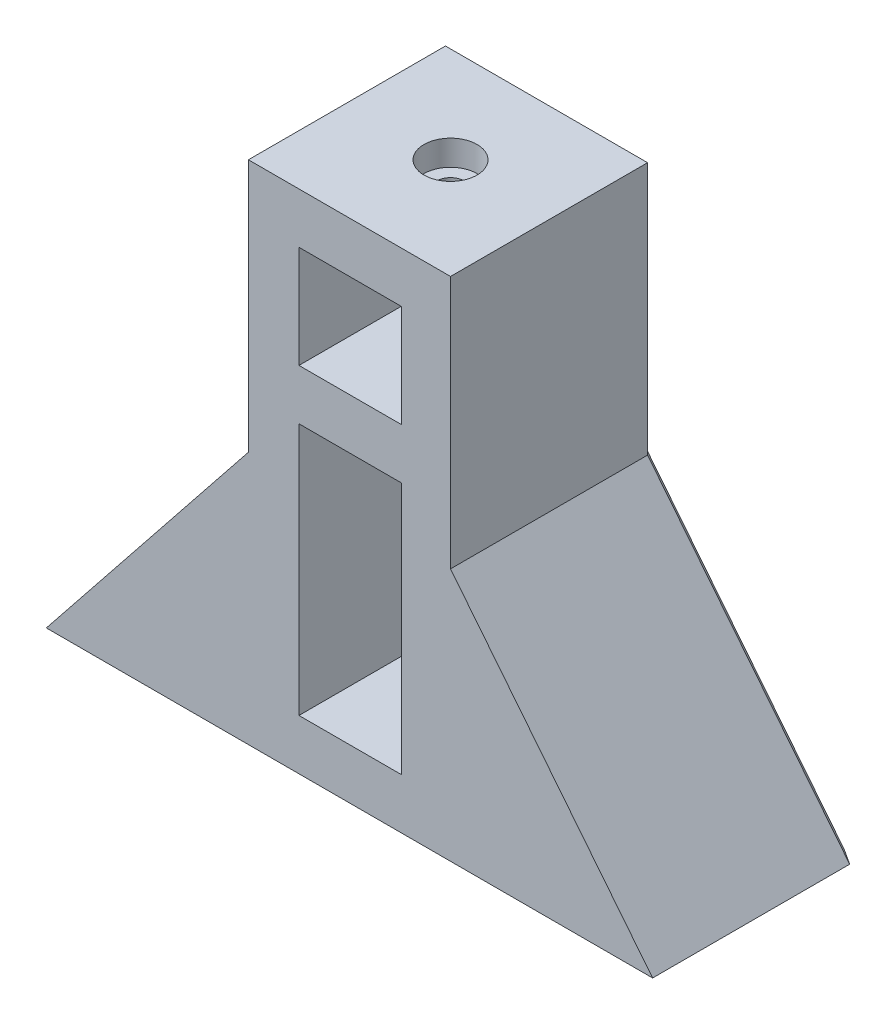
ISO-10303-21;
HEADER;
FILE_DESCRIPTION(('STEP AP214'),'2;1');
FILE_NAME('part.step','',(''),(''),'','','');
FILE_SCHEMA(('AUTOMOTIVE_DESIGN { 1 0 10303 214 1 1 1 1 }'));
ENDSEC;
DATA;
#1=APPLICATION_CONTEXT('core data for automotive mechanical design processes');
#2=APPLICATION_PROTOCOL_DEFINITION('international standard','automotive_design',2000,#1);
#3=PRODUCT_CONTEXT('',#1,'mechanical');
#4=PRODUCT('Part','Part','',(#3));
#5=PRODUCT_RELATED_PRODUCT_CATEGORY('part','',(#4));
#6=PRODUCT_DEFINITION_FORMATION('','',#4);
#7=PRODUCT_DEFINITION_CONTEXT('part definition',#1,'design');
#8=PRODUCT_DEFINITION('design','',#6,#7);
#9=PRODUCT_DEFINITION_SHAPE('','',#8);
#10=(LENGTH_UNIT() NAMED_UNIT(*) SI_UNIT(.MILLI.,.METRE.));
#11=(NAMED_UNIT(*) PLANE_ANGLE_UNIT() SI_UNIT($,.RADIAN.));
#12=(NAMED_UNIT(*) SI_UNIT($,.STERADIAN.) SOLID_ANGLE_UNIT());
#13=UNCERTAINTY_MEASURE_WITH_UNIT(LENGTH_MEASURE(1.E-05),#10,'distance_accuracy_value','');
#14=(GEOMETRIC_REPRESENTATION_CONTEXT(3) GLOBAL_UNCERTAINTY_ASSIGNED_CONTEXT((#13)) GLOBAL_UNIT_ASSIGNED_CONTEXT((#10,
#11,#12)) REPRESENTATION_CONTEXT('',''));
#15=CARTESIAN_POINT('',(0.,0.,0.));
#16=DIRECTION('',(0.,0.,1.));
#17=DIRECTION('',(1.,0.,0.));
#18=AXIS2_PLACEMENT_3D('',#15,#16,#17);
#19=CARTESIAN_POINT('',(0.,10.25,20.));
#20=DIRECTION('',(0.,1.,0.));
#21=DIRECTION('',(-1.,0.,0.));
#22=AXIS2_PLACEMENT_3D('',#19,#20,#21);
#23=CYLINDRICAL_SURFACE('',#22,2.75);
#24=CARTESIAN_POINT('',(0.,20.25,20.));
#25=DIRECTION('',(0.,-1.,0.));
#26=DIRECTION('',(1.,0.,0.));
#27=AXIS2_PLACEMENT_3D('',#24,#25,#26);
#28=CIRCLE('',#27,2.75);
#29=CARTESIAN_POINT('',(2.75,20.25,20.));
#30=VERTEX_POINT('',#29);
#31=EDGE_CURVE('E427',#30,#30,#28,.T.);
#32=ORIENTED_EDGE('',*,*,#31,.T.);
#33=EDGE_LOOP('',(#32));
#34=FACE_BOUND('',#33,.T.);
#35=CARTESIAN_POINT('',(0.,25.25,20.));
#36=DIRECTION('',(0.,1.,0.));
#37=DIRECTION('',(-1.,0.,0.));
#38=AXIS2_PLACEMENT_3D('',#35,#36,#37);
#39=CIRCLE('',#38,2.75);
#40=CARTESIAN_POINT('',(-2.75,25.25,20.));
#41=VERTEX_POINT('',#40);
#42=EDGE_CURVE('E46',#41,#41,#39,.F.);
#43=ORIENTED_EDGE('',*,*,#42,.F.);
#44=EDGE_LOOP('',(#43));
#45=FACE_BOUND('',#44,.T.);
#46=ADVANCED_FACE('F41',(#34,#45),#23,.F.);
#47=CARTESIAN_POINT('',(0.,0.,40.));
#48=DIRECTION('',(0.,0.,1.));
#49=DIRECTION('',(1.,0.,0.));
#50=AXIS2_PLACEMENT_3D('',#47,#48,#49);
#51=PLANE('',#50);
#52=DIRECTION('',(0.,-1.,0.));
#53=VECTOR('',#52,1.);
#54=CARTESIAN_POINT('',(-20.,30.25,40.));
#55=LINE('',#54,#53);
#56=CARTESIAN_POINT('',(-20.,30.25,40.));
#57=VERTEX_POINT('',#56);
#58=CARTESIAN_POINT('',(-20.,-19.875,40.));
#59=VERTEX_POINT('',#58);
#60=EDGE_CURVE('E260',#57,#59,#55,.T.);
#61=ORIENTED_EDGE('',*,*,#60,.T.);
#62=DIRECTION('',(-0.623743755545938,-0.781628893668504,0.));
#63=VECTOR('',#62,1.);
#64=CARTESIAN_POINT('',(-20.,-19.875,40.));
#65=LINE('',#64,#63);
#66=CARTESIAN_POINT('',(-60.,-70.,40.));
#67=VERTEX_POINT('',#66);
#68=EDGE_CURVE('E264',#59,#67,#65,.T.);
#69=ORIENTED_EDGE('',*,*,#68,.T.);
#70=DIRECTION('',(1.,0.,0.));
#71=VECTOR('',#70,1.);
#72=CARTESIAN_POINT('',(-60.,-70.,40.));
#73=LINE('',#72,#71);
#74=CARTESIAN_POINT('',(60.,-70.,40.));
#75=VERTEX_POINT('',#74);
#76=EDGE_CURVE('E267',#67,#75,#73,.T.);
#77=ORIENTED_EDGE('',*,*,#76,.T.);
#78=DIRECTION('',(-0.623743755545938,0.781628893668504,0.));
#79=VECTOR('',#78,1.);
#80=CARTESIAN_POINT('',(20.,-19.875,40.));
#81=LINE('',#80,#79);
#82=CARTESIAN_POINT('',(20.,-19.875,40.));
#83=VERTEX_POINT('',#82);
#84=EDGE_CURVE('E270',#75,#83,#81,.T.);
#85=ORIENTED_EDGE('',*,*,#84,.T.);
#86=DIRECTION('',(0.,1.,0.));
#87=VECTOR('',#86,1.);
#88=CARTESIAN_POINT('',(20.,30.25,40.));
#89=LINE('',#88,#87);
#90=CARTESIAN_POINT('',(20.,30.25,40.));
#91=VERTEX_POINT('',#90);
#92=EDGE_CURVE('E273',#83,#91,#89,.T.);
#93=ORIENTED_EDGE('',*,*,#92,.T.);
#94=DIRECTION('',(-1.,0.,0.));
#95=VECTOR('',#94,1.);
#96=CARTESIAN_POINT('',(-20.,30.25,40.));
#97=LINE('',#96,#95);
#98=EDGE_CURVE('E276',#91,#57,#97,.T.);
#99=ORIENTED_EDGE('',*,*,#98,.T.);
#100=EDGE_LOOP('',(#61,#69,#77,#85,#93,#99));
#101=FACE_BOUND('',#100,.T.);
#102=DIRECTION('',(1.,0.,0.));
#103=VECTOR('',#102,1.);
#104=CARTESIAN_POINT('',(-10.,0.,40.));
#105=LINE('',#104,#103);
#106=CARTESIAN_POINT('',(-10.,0.,40.));
#107=VERTEX_POINT('',#106);
#108=CARTESIAN_POINT('',(10.25,0.,40.));
#109=VERTEX_POINT('',#108);
#110=EDGE_CURVE('E237',#107,#109,#105,.T.);
#111=ORIENTED_EDGE('',*,*,#110,.F.);
#112=DIRECTION('',(0.,-1.,0.));
#113=VECTOR('',#112,1.);
#114=CARTESIAN_POINT('',(-10.,20.25,40.));
#115=LINE('',#114,#113);
#116=CARTESIAN_POINT('',(-10.,20.25,40.));
#117=VERTEX_POINT('',#116);
#118=EDGE_CURVE('E211',#117,#107,#115,.T.);
#119=ORIENTED_EDGE('',*,*,#118,.F.);
#120=DIRECTION('',(-1.,0.,0.));
#121=VECTOR('',#120,1.);
#122=CARTESIAN_POINT('',(-10.,20.25,40.));
#123=LINE('',#122,#121);
#124=CARTESIAN_POINT('',(10.25,20.25,40.));
#125=VERTEX_POINT('',#124);
#126=EDGE_CURVE('E244',#125,#117,#123,.T.);
#127=ORIENTED_EDGE('',*,*,#126,.F.);
#128=DIRECTION('',(0.,1.,0.));
#129=VECTOR('',#128,1.);
#130=CARTESIAN_POINT('',(10.25,20.25,40.));
#131=LINE('',#130,#129);
#132=EDGE_CURVE('E240',#109,#125,#131,.T.);
#133=ORIENTED_EDGE('',*,*,#132,.F.);
#134=EDGE_LOOP('',(#111,#119,#127,#133));
#135=FACE_BOUND('',#134,.T.);
#136=DIRECTION('',(1.,0.,0.));
#137=VECTOR('',#136,1.);
#138=CARTESIAN_POINT('',(-10.,-60.,40.));
#139=LINE('',#138,#137);
#140=CARTESIAN_POINT('',(-10.,-60.,40.));
#141=VERTEX_POINT('',#140);
#142=CARTESIAN_POINT('',(10.25,-60.,40.));
#143=VERTEX_POINT('',#142);
#144=EDGE_CURVE('E201',#141,#143,#139,.T.);
#145=ORIENTED_EDGE('',*,*,#144,.F.);
#146=DIRECTION('',(0.,-1.,0.));
#147=VECTOR('',#146,1.);
#148=CARTESIAN_POINT('',(-10.,-10.,40.));
#149=LINE('',#148,#147);
#150=CARTESIAN_POINT('',(-10.,-10.,40.));
#151=VERTEX_POINT('',#150);
#152=EDGE_CURVE('E190',#151,#141,#149,.T.);
#153=ORIENTED_EDGE('',*,*,#152,.F.);
#154=DIRECTION('',(-1.,0.,0.));
#155=VECTOR('',#154,1.);
#156=CARTESIAN_POINT('',(-10.,-10.,40.));
#157=LINE('',#156,#155);
#158=CARTESIAN_POINT('',(10.25,-10.,40.));
#159=VERTEX_POINT('',#158);
#160=EDGE_CURVE('E221',#159,#151,#157,.T.);
#161=ORIENTED_EDGE('',*,*,#160,.F.);
#162=DIRECTION('',(0.,1.,0.));
#163=VECTOR('',#162,1.);
#164=CARTESIAN_POINT('',(10.25,-10.,40.));
#165=LINE('',#164,#163);
#166=EDGE_CURVE('E217',#143,#159,#165,.T.);
#167=ORIENTED_EDGE('',*,*,#166,.F.);
#168=EDGE_LOOP('',(#145,#153,#161,#167));
#169=FACE_BOUND('',#168,.T.);
#170=ADVANCED_FACE('F215',(#101,#135,#169),#51,.T.);
#171=CARTESIAN_POINT('',(0.,0.,0.));
#172=DIRECTION('',(0.,0.,1.));
#173=DIRECTION('',(1.,0.,0.));
#174=AXIS2_PLACEMENT_3D('',#171,#172,#173);
#175=PLANE('',#174);
#176=DIRECTION('',(0.,1.,0.));
#177=VECTOR('',#176,1.);
#178=CARTESIAN_POINT('',(11.25,-10.,0.));
#179=LINE('',#178,#177);
#180=CARTESIAN_POINT('',(11.25,-61.,0.));
#181=VERTEX_POINT('',#180);
#182=CARTESIAN_POINT('',(11.25,-9.,0.));
#183=VERTEX_POINT('',#182);
#184=EDGE_CURVE('E341',#181,#183,#179,.T.);
#185=ORIENTED_EDGE('',*,*,#184,.T.);
#186=DIRECTION('',(-1.,0.,0.));
#187=VECTOR('',#186,1.);
#188=CARTESIAN_POINT('',(-10.,-9.,0.));
#189=LINE('',#188,#187);
#190=CARTESIAN_POINT('',(-11.,-9.,0.));
#191=VERTEX_POINT('',#190);
#192=EDGE_CURVE('E344',#183,#191,#189,.T.);
#193=ORIENTED_EDGE('',*,*,#192,.T.);
#194=DIRECTION('',(0.,-1.,0.));
#195=VECTOR('',#194,1.);
#196=CARTESIAN_POINT('',(-11.,-60.,0.));
#197=LINE('',#196,#195);
#198=CARTESIAN_POINT('',(-11.,-61.,0.));
#199=VERTEX_POINT('',#198);
#200=EDGE_CURVE('E335',#191,#199,#197,.T.);
#201=ORIENTED_EDGE('',*,*,#200,.T.);
#202=DIRECTION('',(1.,0.,0.));
#203=VECTOR('',#202,1.);
#204=CARTESIAN_POINT('',(10.25,-61.,0.));
#205=LINE('',#204,#203);
#206=EDGE_CURVE('E338',#199,#181,#205,.T.);
#207=ORIENTED_EDGE('',*,*,#206,.T.);
#208=EDGE_LOOP('',(#185,#193,#201,#207));
#209=FACE_BOUND('',#208,.T.);
#210=DIRECTION('',(-1.,0.,0.));
#211=VECTOR('',#210,1.);
#212=CARTESIAN_POINT('',(0.,-69.,0.));
#213=LINE('',#212,#211);
#214=CARTESIAN_POINT('',(57.9226154909332,-69.,0.));
#215=VERTEX_POINT('',#214);
#216=CARTESIAN_POINT('',(-57.9226154909332,-69.,0.));
#217=VERTEX_POINT('',#216);
#218=EDGE_CURVE('E328',#215,#217,#213,.T.);
#219=ORIENTED_EDGE('',*,*,#218,.T.);
#220=DIRECTION('',(0.623743755545938,0.781628893668504,0.));
#221=VECTOR('',#220,1.);
#222=CARTESIAN_POINT('',(-1.74746484077781,1.39448565847606,0.));
#223=LINE('',#222,#221);
#224=CARTESIAN_POINT('',(-19.,-20.2250974629243,0.));
#225=VERTEX_POINT('',#224);
#226=EDGE_CURVE('E331',#217,#225,#223,.T.);
#227=ORIENTED_EDGE('',*,*,#226,.T.);
#228=DIRECTION('',(0.,1.,0.));
#229=VECTOR('',#228,1.);
#230=CARTESIAN_POINT('',(-19.,0.,0.));
#231=LINE('',#230,#229);
#232=CARTESIAN_POINT('',(-19.,29.25,0.));
#233=VERTEX_POINT('',#232);
#234=EDGE_CURVE('E316',#225,#233,#231,.T.);
#235=ORIENTED_EDGE('',*,*,#234,.T.);
#236=DIRECTION('',(1.,0.,0.));
#237=VECTOR('',#236,1.);
#238=CARTESIAN_POINT('',(0.,29.25,0.));
#239=LINE('',#238,#237);
#240=CARTESIAN_POINT('',(19.,29.25,0.));
#241=VERTEX_POINT('',#240);
#242=EDGE_CURVE('E319',#233,#241,#239,.T.);
#243=ORIENTED_EDGE('',*,*,#242,.T.);
#244=DIRECTION('',(0.,-1.,0.));
#245=VECTOR('',#244,1.);
#246=CARTESIAN_POINT('',(19.,0.,0.));
#247=LINE('',#246,#245);
#248=CARTESIAN_POINT('',(19.,-20.2250974629243,0.));
#249=VERTEX_POINT('',#248);
#250=EDGE_CURVE('E322',#241,#249,#247,.T.);
#251=ORIENTED_EDGE('',*,*,#250,.T.);
#252=DIRECTION('',(0.623743755545938,-0.781628893668504,0.));
#253=VECTOR('',#252,1.);
#254=CARTESIAN_POINT('',(1.74746484077781,1.39448565847606,0.));
#255=LINE('',#254,#253);
#256=EDGE_CURVE('E325',#249,#215,#255,.T.);
#257=ORIENTED_EDGE('',*,*,#256,.T.);
#258=EDGE_LOOP('',(#219,#227,#235,#243,#251,#257));
#259=FACE_BOUND('',#258,.T.);
#260=DIRECTION('',(0.,1.,0.));
#261=VECTOR('',#260,1.);
#262=CARTESIAN_POINT('',(11.25,20.25,0.));
#263=LINE('',#262,#261);
#264=CARTESIAN_POINT('',(11.25,-1.,0.));
#265=VERTEX_POINT('',#264);
#266=CARTESIAN_POINT('',(11.25,21.25,0.));
#267=VERTEX_POINT('',#266);
#268=EDGE_CURVE('E309',#265,#267,#263,.T.);
#269=ORIENTED_EDGE('',*,*,#268,.T.);
#270=DIRECTION('',(-1.,0.,0.));
#271=VECTOR('',#270,1.);
#272=CARTESIAN_POINT('',(-10.,21.25,0.));
#273=LINE('',#272,#271);
#274=CARTESIAN_POINT('',(-11.,21.25,0.));
#275=VERTEX_POINT('',#274);
#276=EDGE_CURVE('E312',#267,#275,#273,.T.);
#277=ORIENTED_EDGE('',*,*,#276,.T.);
#278=DIRECTION('',(0.,-1.,0.));
#279=VECTOR('',#278,1.);
#280=CARTESIAN_POINT('',(-11.,0.,0.));
#281=LINE('',#280,#279);
#282=CARTESIAN_POINT('',(-11.,-1.,0.));
#283=VERTEX_POINT('',#282);
#284=EDGE_CURVE('E303',#275,#283,#281,.T.);
#285=ORIENTED_EDGE('',*,*,#284,.T.);
#286=DIRECTION('',(1.,0.,0.));
#287=VECTOR('',#286,1.);
#288=CARTESIAN_POINT('',(10.25,-1.,0.));
#289=LINE('',#288,#287);
#290=EDGE_CURVE('E306',#283,#265,#289,.T.);
#291=ORIENTED_EDGE('',*,*,#290,.T.);
#292=EDGE_LOOP('',(#269,#277,#285,#291));
#293=FACE_BOUND('',#292,.T.);
#294=ADVANCED_FACE('F512',(#209,#259,#293),#175,.F.);
#295=CARTESIAN_POINT('',(-20.,30.25,40.));
#296=DIRECTION('',(1.,0.,0.));
#297=DIRECTION('',(0.,1.,0.));
#298=AXIS2_PLACEMENT_3D('',#295,#296,#297);
#299=PLANE('',#298);
#300=DIRECTION('',(0.,0.,-1.));
#301=VECTOR('',#300,1.);
#302=CARTESIAN_POINT('',(-20.,30.25,40.));
#303=LINE('',#302,#301);
#304=CARTESIAN_POINT('',(-20.,30.25,1.));
#305=VERTEX_POINT('',#304);
#306=EDGE_CURVE('E279',#57,#305,#303,.T.);
#307=ORIENTED_EDGE('',*,*,#306,.T.);
#308=DIRECTION('',(0.,-1.,0.));
#309=VECTOR('',#308,1.);
#310=CARTESIAN_POINT('',(-20.,30.25,1.));
#311=LINE('',#310,#309);
#312=CARTESIAN_POINT('',(-20.,-19.875,1.));
#313=VERTEX_POINT('',#312);
#314=EDGE_CURVE('E376',#305,#313,#311,.T.);
#315=ORIENTED_EDGE('',*,*,#314,.T.);
#316=DIRECTION('',(0.,0.,-1.));
#317=VECTOR('',#316,1.);
#318=CARTESIAN_POINT('',(-20.,-19.875,40.));
#319=LINE('',#318,#317);
#320=EDGE_CURVE('E299',#59,#313,#319,.T.);
#321=ORIENTED_EDGE('',*,*,#320,.F.);
#322=ORIENTED_EDGE('',*,*,#60,.F.);
#323=EDGE_LOOP('',(#307,#315,#321,#322));
#324=FACE_BOUND('',#323,.T.);
#325=ADVANCED_FACE('F487',(#324),#299,.F.);
#326=CARTESIAN_POINT('',(-20.,-19.875,40.));
#327=DIRECTION('',(0.781628893668504,-0.623743755545938,0.));
#328=DIRECTION('',(0.623743755545938,0.781628893668504,0.));
#329=AXIS2_PLACEMENT_3D('',#326,#327,#328);
#330=PLANE('',#329);
#331=ORIENTED_EDGE('',*,*,#320,.T.);
#332=DIRECTION('',(-0.623743755545938,-0.781628893668504,0.));
#333=VECTOR('',#332,1.);
#334=CARTESIAN_POINT('',(-20.,-19.875,1.));
#335=LINE('',#334,#333);
#336=CARTESIAN_POINT('',(-60.,-70.,1.));
#337=VERTEX_POINT('',#336);
#338=EDGE_CURVE('E360',#313,#337,#335,.T.);
#339=ORIENTED_EDGE('',*,*,#338,.T.);
#340=DIRECTION('',(0.,0.,-1.));
#341=VECTOR('',#340,1.);
#342=CARTESIAN_POINT('',(-60.,-70.,40.));
#343=LINE('',#342,#341);
#344=EDGE_CURVE('E295',#67,#337,#343,.T.);
#345=ORIENTED_EDGE('',*,*,#344,.F.);
#346=ORIENTED_EDGE('',*,*,#68,.F.);
#347=EDGE_LOOP('',(#331,#339,#345,#346));
#348=FACE_BOUND('',#347,.T.);
#349=ADVANCED_FACE('F490',(#348),#330,.F.);
#350=CARTESIAN_POINT('',(60.,-70.,40.));
#351=DIRECTION('',(0.,1.,0.));
#352=DIRECTION('',(0.,0.,1.));
#353=AXIS2_PLACEMENT_3D('',#350,#351,#352);
#354=PLANE('',#353);
#355=ORIENTED_EDGE('',*,*,#344,.T.);
#356=DIRECTION('',(1.,0.,0.));
#357=VECTOR('',#356,1.);
#358=CARTESIAN_POINT('',(60.,-70.,1.));
#359=LINE('',#358,#357);
#360=CARTESIAN_POINT('',(60.,-70.,1.));
#361=VERTEX_POINT('',#360);
#362=EDGE_CURVE('E364',#337,#361,#359,.T.);
#363=ORIENTED_EDGE('',*,*,#362,.T.);
#364=DIRECTION('',(0.,0.,-1.));
#365=VECTOR('',#364,1.);
#366=CARTESIAN_POINT('',(60.,-70.,40.));
#367=LINE('',#366,#365);
#368=EDGE_CURVE('E291',#75,#361,#367,.T.);
#369=ORIENTED_EDGE('',*,*,#368,.F.);
#370=ORIENTED_EDGE('',*,*,#76,.F.);
#371=EDGE_LOOP('',(#355,#363,#369,#370));
#372=FACE_BOUND('',#371,.T.);
#373=ADVANCED_FACE('F570',(#372),#354,.F.);
#374=CARTESIAN_POINT('',(20.,-19.875,40.));
#375=DIRECTION('',(-0.781628893668504,-0.623743755545938,0.));
#376=DIRECTION('',(0.623743755545938,-0.781628893668504,0.));
#377=AXIS2_PLACEMENT_3D('',#374,#375,#376);
#378=PLANE('',#377);
#379=ORIENTED_EDGE('',*,*,#368,.T.);
#380=DIRECTION('',(-0.623743755545938,0.781628893668504,0.));
#381=VECTOR('',#380,1.);
#382=CARTESIAN_POINT('',(20.,-19.875,1.));
#383=LINE('',#382,#381);
#384=CARTESIAN_POINT('',(20.,-19.875,1.));
#385=VERTEX_POINT('',#384);
#386=EDGE_CURVE('E367',#361,#385,#383,.T.);
#387=ORIENTED_EDGE('',*,*,#386,.T.);
#388=DIRECTION('',(0.,0.,-1.));
#389=VECTOR('',#388,1.);
#390=CARTESIAN_POINT('',(20.,-19.875,40.));
#391=LINE('',#390,#389);
#392=EDGE_CURVE('E287',#83,#385,#391,.T.);
#393=ORIENTED_EDGE('',*,*,#392,.F.);
#394=ORIENTED_EDGE('',*,*,#84,.F.);
#395=EDGE_LOOP('',(#379,#387,#393,#394));
#396=FACE_BOUND('',#395,.T.);
#397=ADVANCED_FACE('F498',(#396),#378,.F.);
#398=CARTESIAN_POINT('',(20.,30.25,40.));
#399=DIRECTION('',(-1.,0.,0.));
#400=DIRECTION('',(0.,-1.,0.));
#401=AXIS2_PLACEMENT_3D('',#398,#399,#400);
#402=PLANE('',#401);
#403=ORIENTED_EDGE('',*,*,#392,.T.);
#404=DIRECTION('',(0.,1.,0.));
#405=VECTOR('',#404,1.);
#406=CARTESIAN_POINT('',(20.,30.25,1.));
#407=LINE('',#406,#405);
#408=CARTESIAN_POINT('',(20.,30.25,1.));
#409=VERTEX_POINT('',#408);
#410=EDGE_CURVE('E370',#385,#409,#407,.T.);
#411=ORIENTED_EDGE('',*,*,#410,.T.);
#412=DIRECTION('',(0.,0.,-1.));
#413=VECTOR('',#412,1.);
#414=CARTESIAN_POINT('',(20.,30.25,40.));
#415=LINE('',#414,#413);
#416=EDGE_CURVE('E283',#91,#409,#415,.T.);
#417=ORIENTED_EDGE('',*,*,#416,.F.);
#418=ORIENTED_EDGE('',*,*,#92,.F.);
#419=EDGE_LOOP('',(#403,#411,#417,#418));
#420=FACE_BOUND('',#419,.T.);
#421=ADVANCED_FACE('F461',(#420),#402,.F.);
#422=CARTESIAN_POINT('',(-20.,30.25,40.));
#423=DIRECTION('',(0.,-1.,0.));
#424=DIRECTION('',(1.,0.,0.));
#425=AXIS2_PLACEMENT_3D('',#422,#423,#424);
#426=PLANE('',#425);
#427=CARTESIAN_POINT('',(0.,30.25,20.));
#428=DIRECTION('',(0.,1.,0.));
#429=DIRECTION('',(-1.,0.,0.));
#430=AXIS2_PLACEMENT_3D('',#427,#428,#429);
#431=CIRCLE('',#430,5.25);
#432=CARTESIAN_POINT('',(-5.25,30.25,20.));
#433=VERTEX_POINT('',#432);
#434=EDGE_CURVE('E447',#433,#433,#431,.T.);
#435=ORIENTED_EDGE('',*,*,#434,.F.);
#436=EDGE_LOOP('',(#435));
#437=FACE_BOUND('',#436,.T.);
#438=ORIENTED_EDGE('',*,*,#416,.T.);
#439=DIRECTION('',(-1.,0.,0.));
#440=VECTOR('',#439,1.);
#441=CARTESIAN_POINT('',(-20.,30.25,1.));
#442=LINE('',#441,#440);
#443=EDGE_CURVE('E373',#409,#305,#442,.T.);
#444=ORIENTED_EDGE('',*,*,#443,.T.);
#445=ORIENTED_EDGE('',*,*,#306,.F.);
#446=ORIENTED_EDGE('',*,*,#98,.F.);
#447=EDGE_LOOP('',(#438,#444,#445,#446));
#448=FACE_BOUND('',#447,.T.);
#449=ADVANCED_FACE('F457',(#437,#448),#426,.F.);
#450=CARTESIAN_POINT('',(-10.,20.25,40.));
#451=DIRECTION('',(1.,0.,0.));
#452=DIRECTION('',(0.,1.,0.));
#453=AXIS2_PLACEMENT_3D('',#450,#451,#452);
#454=PLANE('',#453);
#455=DIRECTION('',(0.,0.,-1.));
#456=VECTOR('',#455,1.);
#457=CARTESIAN_POINT('',(-10.,0.,40.));
#458=LINE('',#457,#456);
#459=CARTESIAN_POINT('',(-10.,0.,1.));
#460=VERTEX_POINT('',#459);
#461=EDGE_CURVE('E257',#107,#460,#458,.T.);
#462=ORIENTED_EDGE('',*,*,#461,.T.);
#463=DIRECTION('',(0.,1.,0.));
#464=VECTOR('',#463,1.);
#465=CARTESIAN_POINT('',(-10.,20.25,1.));
#466=LINE('',#465,#464);
#467=CARTESIAN_POINT('',(-10.,20.25,1.));
#468=VERTEX_POINT('',#467);
#469=EDGE_CURVE('E11',#460,#468,#466,.T.);
#470=ORIENTED_EDGE('',*,*,#469,.T.);
#471=DIRECTION('',(0.,0.,-1.));
#472=VECTOR('',#471,1.);
#473=CARTESIAN_POINT('',(-10.,20.25,40.));
#474=LINE('',#473,#472);
#475=EDGE_CURVE('E247',#117,#468,#474,.T.);
#476=ORIENTED_EDGE('',*,*,#475,.F.);
#477=ORIENTED_EDGE('',*,*,#118,.T.);
#478=EDGE_LOOP('',(#462,#470,#476,#477));
#479=FACE_BOUND('',#478,.T.);
#480=ADVANCED_FACE('F460',(#479),#454,.T.);
#481=CARTESIAN_POINT('',(-10.,0.,40.));
#482=DIRECTION('',(0.,1.,0.));
#483=DIRECTION('',(-1.,0.,0.));
#484=AXIS2_PLACEMENT_3D('',#481,#482,#483);
#485=PLANE('',#484);
#486=DIRECTION('',(0.,0.,-1.));
#487=VECTOR('',#486,1.);
#488=CARTESIAN_POINT('',(10.25,0.,40.));
#489=LINE('',#488,#487);
#490=CARTESIAN_POINT('',(10.25,0.,1.));
#491=VERTEX_POINT('',#490);
#492=EDGE_CURVE('E254',#109,#491,#489,.T.);
#493=ORIENTED_EDGE('',*,*,#492,.T.);
#494=DIRECTION('',(-1.,0.,0.));
#495=VECTOR('',#494,1.);
#496=CARTESIAN_POINT('',(-10.,0.,1.));
#497=LINE('',#496,#495);
#498=EDGE_CURVE('E52',#491,#460,#497,.T.);
#499=ORIENTED_EDGE('',*,*,#498,.T.);
#500=ORIENTED_EDGE('',*,*,#461,.F.);
#501=ORIENTED_EDGE('',*,*,#110,.T.);
#502=EDGE_LOOP('',(#493,#499,#500,#501));
#503=FACE_BOUND('',#502,.T.);
#504=ADVANCED_FACE('F557',(#503),#485,.T.);
#505=CARTESIAN_POINT('',(10.25,20.25,40.));
#506=DIRECTION('',(-1.,0.,0.));
#507=DIRECTION('',(0.,-1.,0.));
#508=AXIS2_PLACEMENT_3D('',#505,#506,#507);
#509=PLANE('',#508);
#510=DIRECTION('',(0.,0.,-1.));
#511=VECTOR('',#510,1.);
#512=CARTESIAN_POINT('',(10.25,20.25,40.));
#513=LINE('',#512,#511);
#514=CARTESIAN_POINT('',(10.25,20.25,1.));
#515=VERTEX_POINT('',#514);
#516=EDGE_CURVE('E251',#125,#515,#513,.T.);
#517=ORIENTED_EDGE('',*,*,#516,.T.);
#518=DIRECTION('',(0.,-1.,0.));
#519=VECTOR('',#518,1.);
#520=CARTESIAN_POINT('',(10.25,0.,1.));
#521=LINE('',#520,#519);
#522=EDGE_CURVE('E67',#515,#491,#521,.T.);
#523=ORIENTED_EDGE('',*,*,#522,.T.);
#524=ORIENTED_EDGE('',*,*,#492,.F.);
#525=ORIENTED_EDGE('',*,*,#132,.T.);
#526=EDGE_LOOP('',(#517,#523,#524,#525));
#527=FACE_BOUND('',#526,.T.);
#528=ADVANCED_FACE('F553',(#527),#509,.T.);
#529=CARTESIAN_POINT('',(-10.,20.25,40.));
#530=DIRECTION('',(0.,-1.,0.));
#531=DIRECTION('',(1.,0.,0.));
#532=AXIS2_PLACEMENT_3D('',#529,#530,#531);
#533=PLANE('',#532);
#534=ORIENTED_EDGE('',*,*,#31,.F.);
#535=EDGE_LOOP('',(#534));
#536=FACE_BOUND('',#535,.T.);
#537=ORIENTED_EDGE('',*,*,#475,.T.);
#538=DIRECTION('',(1.,0.,0.));
#539=VECTOR('',#538,1.);
#540=CARTESIAN_POINT('',(10.25,20.25,1.));
#541=LINE('',#540,#539);
#542=EDGE_CURVE('E379',#468,#515,#541,.T.);
#543=ORIENTED_EDGE('',*,*,#542,.T.);
#544=ORIENTED_EDGE('',*,*,#516,.F.);
#545=ORIENTED_EDGE('',*,*,#126,.T.);
#546=EDGE_LOOP('',(#537,#543,#544,#545));
#547=FACE_BOUND('',#546,.T.);
#548=ADVANCED_FACE('F550',(#536,#547),#533,.T.);
#549=CARTESIAN_POINT('',(-10.,-10.,40.));
#550=DIRECTION('',(1.,0.,0.));
#551=DIRECTION('',(0.,1.,0.));
#552=AXIS2_PLACEMENT_3D('',#549,#550,#551);
#553=PLANE('',#552);
#554=DIRECTION('',(0.,0.,-1.));
#555=VECTOR('',#554,1.);
#556=CARTESIAN_POINT('',(-10.,-60.,40.));
#557=LINE('',#556,#555);
#558=CARTESIAN_POINT('',(-10.,-60.,1.));
#559=VERTEX_POINT('',#558);
#560=EDGE_CURVE('E193',#141,#559,#557,.T.);
#561=ORIENTED_EDGE('',*,*,#560,.T.);
#562=DIRECTION('',(0.,1.,0.));
#563=VECTOR('',#562,1.);
#564=CARTESIAN_POINT('',(-10.,-10.,1.));
#565=LINE('',#564,#563);
#566=CARTESIAN_POINT('',(-10.,-10.,1.));
#567=VERTEX_POINT('',#566);
#568=EDGE_CURVE('E357',#559,#567,#565,.T.);
#569=ORIENTED_EDGE('',*,*,#568,.T.);
#570=DIRECTION('',(0.,0.,-1.));
#571=VECTOR('',#570,1.);
#572=CARTESIAN_POINT('',(-10.,-10.,40.));
#573=LINE('',#572,#571);
#574=EDGE_CURVE('E196',#151,#567,#573,.T.);
#575=ORIENTED_EDGE('',*,*,#574,.F.);
#576=ORIENTED_EDGE('',*,*,#152,.T.);
#577=EDGE_LOOP('',(#561,#569,#575,#576));
#578=FACE_BOUND('',#577,.T.);
#579=ADVANCED_FACE('F192',(#578),#553,.T.);
#580=CARTESIAN_POINT('',(-10.,-60.,40.));
#581=DIRECTION('',(0.,1.,0.));
#582=DIRECTION('',(-1.,0.,0.));
#583=AXIS2_PLACEMENT_3D('',#580,#581,#582);
#584=PLANE('',#583);
#585=DIRECTION('',(0.,0.,-1.));
#586=VECTOR('',#585,1.);
#587=CARTESIAN_POINT('',(10.25,-60.,40.));
#588=LINE('',#587,#586);
#589=CARTESIAN_POINT('',(10.25,-60.,1.));
#590=VERTEX_POINT('',#589);
#591=EDGE_CURVE('E212',#143,#590,#588,.T.);
#592=ORIENTED_EDGE('',*,*,#591,.T.);
#593=DIRECTION('',(-1.,0.,0.));
#594=VECTOR('',#593,1.);
#595=CARTESIAN_POINT('',(-10.,-60.,1.));
#596=LINE('',#595,#594);
#597=EDGE_CURVE('E209',#590,#559,#596,.T.);
#598=ORIENTED_EDGE('',*,*,#597,.T.);
#599=ORIENTED_EDGE('',*,*,#560,.F.);
#600=ORIENTED_EDGE('',*,*,#144,.T.);
#601=EDGE_LOOP('',(#592,#598,#599,#600));
#602=FACE_BOUND('',#601,.T.);
#603=ADVANCED_FACE('F206',(#602),#584,.T.);
#604=CARTESIAN_POINT('',(10.25,-10.,40.));
#605=DIRECTION('',(-1.,0.,0.));
#606=DIRECTION('',(0.,-1.,0.));
#607=AXIS2_PLACEMENT_3D('',#604,#605,#606);
#608=PLANE('',#607);
#609=DIRECTION('',(0.,0.,-1.));
#610=VECTOR('',#609,1.);
#611=CARTESIAN_POINT('',(10.25,-10.,40.));
#612=LINE('',#611,#610);
#613=CARTESIAN_POINT('',(10.25,-10.,1.));
#614=VERTEX_POINT('',#613);
#615=EDGE_CURVE('E229',#159,#614,#612,.T.);
#616=ORIENTED_EDGE('',*,*,#615,.T.);
#617=DIRECTION('',(0.,-1.,0.));
#618=VECTOR('',#617,1.);
#619=CARTESIAN_POINT('',(10.25,-60.,1.));
#620=LINE('',#619,#618);
#621=EDGE_CURVE('E352',#614,#590,#620,.T.);
#622=ORIENTED_EDGE('',*,*,#621,.T.);
#623=ORIENTED_EDGE('',*,*,#591,.F.);
#624=ORIENTED_EDGE('',*,*,#166,.T.);
#625=EDGE_LOOP('',(#616,#622,#623,#624));
#626=FACE_BOUND('',#625,.T.);
#627=ADVANCED_FACE('F541',(#626),#608,.T.);
#628=CARTESIAN_POINT('',(-10.,-10.,40.));
#629=DIRECTION('',(0.,-1.,0.));
#630=DIRECTION('',(0.,0.,-1.));
#631=AXIS2_PLACEMENT_3D('',#628,#629,#630);
#632=PLANE('',#631);
#633=ORIENTED_EDGE('',*,*,#574,.T.);
#634=DIRECTION('',(1.,0.,0.));
#635=VECTOR('',#634,1.);
#636=CARTESIAN_POINT('',(10.25,-10.,1.));
#637=LINE('',#636,#635);
#638=EDGE_CURVE('E348',#567,#614,#637,.T.);
#639=ORIENTED_EDGE('',*,*,#638,.T.);
#640=ORIENTED_EDGE('',*,*,#615,.F.);
#641=ORIENTED_EDGE('',*,*,#160,.T.);
#642=EDGE_LOOP('',(#633,#639,#640,#641));
#643=FACE_BOUND('',#642,.T.);
#644=ADVANCED_FACE('F537',(#643),#632,.T.);
#645=CARTESIAN_POINT('',(0.,-61.,0.));
#646=DIRECTION('',(0.,0.707106781186546,-0.707106781186549));
#647=DIRECTION('',(-1.,0.,0.));
#648=AXIS2_PLACEMENT_3D('',#645,#646,#647);
#649=PLANE('',#648);
#650=DIRECTION('',(-0.577350269189625,-0.577350269189627,-0.577350269189625));
#651=VECTOR('',#650,1.);
#652=CARTESIAN_POINT('',(-7.33333333333336,-57.3333333333333,3.66666666666665));
#653=LINE('',#652,#651);
#654=EDGE_CURVE('E394',#559,#199,#653,.T.);
#655=ORIENTED_EDGE('',*,*,#654,.F.);
#656=ORIENTED_EDGE('',*,*,#597,.F.);
#657=DIRECTION('',(0.577350269189625,-0.577350269189627,-0.577350269189625));
#658=VECTOR('',#657,1.);
#659=CARTESIAN_POINT('',(-9.08333333333337,-40.6666666666666,20.3333333333334));
#660=LINE('',#659,#658);
#661=EDGE_CURVE('E202',#181,#590,#660,.F.);
#662=ORIENTED_EDGE('',*,*,#661,.F.);
#663=ORIENTED_EDGE('',*,*,#206,.F.);
#664=EDGE_LOOP('',(#655,#656,#662,#663));
#665=FACE_BOUND('',#664,.T.);
#666=ADVANCED_FACE('F540',(#665),#649,.T.);
#667=CARTESIAN_POINT('',(11.25,0.,0.));
#668=DIRECTION('',(-0.707106781186547,0.,-0.707106781186547));
#669=DIRECTION('',(0.,-1.,0.));
#670=AXIS2_PLACEMENT_3D('',#667,#668,#669);
#671=PLANE('',#670);
#672=ORIENTED_EDGE('',*,*,#661,.T.);
#673=ORIENTED_EDGE('',*,*,#621,.F.);
#674=DIRECTION('',(0.577350269189626,0.577350269189626,-0.577350269189626));
#675=VECTOR('',#674,1.);
#676=CARTESIAN_POINT('',(7.5,-12.75,3.75));
#677=LINE('',#676,#675);
#678=EDGE_CURVE('E390',#183,#614,#677,.F.);
#679=ORIENTED_EDGE('',*,*,#678,.F.);
#680=ORIENTED_EDGE('',*,*,#184,.F.);
#681=EDGE_LOOP('',(#672,#673,#679,#680));
#682=FACE_BOUND('',#681,.T.);
#683=ADVANCED_FACE('F593',(#682),#671,.T.);
#684=CARTESIAN_POINT('',(-11.,0.,0.));
#685=DIRECTION('',(0.707106781186547,0.,-0.707106781186547));
#686=DIRECTION('',(0.,1.,0.));
#687=AXIS2_PLACEMENT_3D('',#684,#685,#686);
#688=PLANE('',#687);
#689=ORIENTED_EDGE('',*,*,#654,.T.);
#690=ORIENTED_EDGE('',*,*,#200,.F.);
#691=DIRECTION('',(0.577350269189626,-0.577350269189626,0.577350269189626));
#692=VECTOR('',#691,1.);
#693=CARTESIAN_POINT('',(-7.33333333333335,-12.6666666666667,3.66666666666667));
#694=LINE('',#693,#692);
#695=EDGE_CURVE('E387',#567,#191,#694,.F.);
#696=ORIENTED_EDGE('',*,*,#695,.F.);
#697=ORIENTED_EDGE('',*,*,#568,.F.);
#698=EDGE_LOOP('',(#689,#690,#696,#697));
#699=FACE_BOUND('',#698,.T.);
#700=ADVANCED_FACE('F586',(#699),#688,.T.);
#701=CARTESIAN_POINT('',(0.,-9.,0.));
#702=DIRECTION('',(0.,-0.707106781186547,-0.707106781186547));
#703=DIRECTION('',(1.,0.,0.));
#704=AXIS2_PLACEMENT_3D('',#701,#702,#703);
#705=PLANE('',#704);
#706=ORIENTED_EDGE('',*,*,#678,.T.);
#707=ORIENTED_EDGE('',*,*,#638,.F.);
#708=ORIENTED_EDGE('',*,*,#695,.T.);
#709=ORIENTED_EDGE('',*,*,#192,.F.);
#710=EDGE_LOOP('',(#706,#707,#708,#709));
#711=FACE_BOUND('',#710,.T.);
#712=ADVANCED_FACE('F579',(#711),#705,.T.);
#713=CARTESIAN_POINT('',(20.,30.25,1.));
#714=DIRECTION('',(-0.707106781186547,0.,0.707106781186548));
#715=DIRECTION('',(0.,1.,0.));
#716=AXIS2_PLACEMENT_3D('',#713,#714,#715);
#717=PLANE('',#716);
#718=DIRECTION('',(-0.686387190249979,-0.240302413890243,-0.686387190249979));
#719=VECTOR('',#718,1.);
#720=CARTESIAN_POINT('',(20.,-19.875,1.));
#721=LINE('',#720,#719);
#722=EDGE_CURVE('E416',#249,#385,#721,.F.);
#723=ORIENTED_EDGE('',*,*,#722,.F.);
#724=ORIENTED_EDGE('',*,*,#250,.F.);
#725=DIRECTION('',(-0.577350269189626,-0.577350269189625,-0.577350269189626));
#726=VECTOR('',#725,1.);
#727=CARTESIAN_POINT('',(6.66666666666664,16.9166666666667,-12.3333333333333));
#728=LINE('',#727,#726);
#729=EDGE_CURVE('E391',#409,#241,#728,.T.);
#730=ORIENTED_EDGE('',*,*,#729,.F.);
#731=ORIENTED_EDGE('',*,*,#410,.F.);
#732=EDGE_LOOP('',(#723,#724,#730,#731));
#733=FACE_BOUND('',#732,.T.);
#734=ADVANCED_FACE('F474',(#733),#717,.F.);
#735=CARTESIAN_POINT('',(-20.,30.25,1.));
#736=DIRECTION('',(0.,-0.707106781186548,0.707106781186547));
#737=DIRECTION('',(-1.,0.,0.));
#738=AXIS2_PLACEMENT_3D('',#735,#736,#737);
#739=PLANE('',#738);
#740=ORIENTED_EDGE('',*,*,#729,.T.);
#741=ORIENTED_EDGE('',*,*,#242,.F.);
#742=DIRECTION('',(0.577350269189625,-0.577350269189626,-0.577350269189627));
#743=VECTOR('',#742,1.);
#744=CARTESIAN_POINT('',(-20.,30.25,1.));
#745=LINE('',#744,#743);
#746=EDGE_CURVE('E412',#305,#233,#745,.T.);
#747=ORIENTED_EDGE('',*,*,#746,.F.);
#748=ORIENTED_EDGE('',*,*,#443,.F.);
#749=EDGE_LOOP('',(#740,#741,#747,#748));
#750=FACE_BOUND('',#749,.T.);
#751=ADVANCED_FACE('F478',(#750),#739,.F.);
#752=CARTESIAN_POINT('',(20.,-19.875,1.));
#753=DIRECTION('',(-0.552695091084338,-0.441053439269297,0.707106781186547));
#754=DIRECTION('',(-0.623743755545938,0.781628893668504,0.));
#755=AXIS2_PLACEMENT_3D('',#752,#753,#754);
#756=PLANE('',#755);
#757=ORIENTED_EDGE('',*,*,#722,.T.);
#758=ORIENTED_EDGE('',*,*,#386,.F.);
#759=DIRECTION('',(-0.826631805876707,0.397919500347127,-0.397919500347127));
#760=VECTOR('',#759,1.);
#761=CARTESIAN_POINT('',(16.1794319278498,-48.90589446446,-20.09410553554));
#762=LINE('',#761,#760);
#763=EDGE_CURVE('E408',#215,#361,#762,.F.);
#764=ORIENTED_EDGE('',*,*,#763,.F.);
#765=ORIENTED_EDGE('',*,*,#256,.F.);
#766=EDGE_LOOP('',(#757,#758,#764,#765));
#767=FACE_BOUND('',#766,.T.);
#768=ADVANCED_FACE('F503',(#767),#756,.F.);
#769=CARTESIAN_POINT('',(-20.,30.25,1.));
#770=DIRECTION('',(0.707106781186549,0.,0.707106781186546));
#771=DIRECTION('',(0.,-1.,0.));
#772=AXIS2_PLACEMENT_3D('',#769,#770,#771);
#773=PLANE('',#772);
#774=ORIENTED_EDGE('',*,*,#746,.T.);
#775=ORIENTED_EDGE('',*,*,#234,.F.);
#776=DIRECTION('',(-0.686387190249977,0.240302413890247,0.68638719024998));
#777=VECTOR('',#776,1.);
#778=CARTESIAN_POINT('',(-20.,-19.875,1.));
#779=LINE('',#778,#777);
#780=EDGE_CURVE('E404',#313,#225,#779,.F.);
#781=ORIENTED_EDGE('',*,*,#780,.F.);
#782=ORIENTED_EDGE('',*,*,#314,.F.);
#783=EDGE_LOOP('',(#774,#775,#781,#782));
#784=FACE_BOUND('',#783,.T.);
#785=ADVANCED_FACE('F483',(#784),#773,.F.);
#786=CARTESIAN_POINT('',(60.,-70.,1.));
#787=DIRECTION('',(0.,0.707106781186547,0.707106781186547));
#788=DIRECTION('',(1.,0.,0.));
#789=AXIS2_PLACEMENT_3D('',#786,#787,#788);
#790=PLANE('',#789);
#791=ORIENTED_EDGE('',*,*,#763,.T.);
#792=ORIENTED_EDGE('',*,*,#362,.F.);
#793=DIRECTION('',(0.826631805876707,0.397919500347127,-0.397919500347127));
#794=VECTOR('',#793,1.);
#795=CARTESIAN_POINT('',(21.9984170984382,-30.5280501801397,-38.4719498198603));
#796=LINE('',#795,#794);
#797=EDGE_CURVE('E401',#217,#337,#796,.F.);
#798=ORIENTED_EDGE('',*,*,#797,.F.);
#799=ORIENTED_EDGE('',*,*,#218,.F.);
#800=EDGE_LOOP('',(#791,#792,#798,#799));
#801=FACE_BOUND('',#800,.T.);
#802=ADVANCED_FACE('F508',(#801),#790,.F.);
#803=CARTESIAN_POINT('',(-20.,-19.875,1.));
#804=DIRECTION('',(0.552695091084338,-0.441053439269297,0.707106781186547));
#805=DIRECTION('',(-0.623743755545938,-0.781628893668504,0.));
#806=AXIS2_PLACEMENT_3D('',#803,#804,#805);
#807=PLANE('',#806);
#808=ORIENTED_EDGE('',*,*,#780,.T.);
#809=ORIENTED_EDGE('',*,*,#226,.F.);
#810=ORIENTED_EDGE('',*,*,#797,.T.);
#811=ORIENTED_EDGE('',*,*,#338,.F.);
#812=EDGE_LOOP('',(#808,#809,#810,#811));
#813=FACE_BOUND('',#812,.T.);
#814=ADVANCED_FACE('F515',(#813),#807,.F.);
#815=CARTESIAN_POINT('',(0.,-1.,0.));
#816=DIRECTION('',(0.,0.707106781186547,-0.707106781186547));
#817=DIRECTION('',(-1.,0.,0.));
#818=AXIS2_PLACEMENT_3D('',#815,#816,#817);
#819=PLANE('',#818);
#820=DIRECTION('',(-0.577350269189626,-0.577350269189626,-0.577350269189626));
#821=VECTOR('',#820,1.);
#822=CARTESIAN_POINT('',(-7.33333333333334,2.66666666666667,3.66666666666667));
#823=LINE('',#822,#821);
#824=EDGE_CURVE('E430',#460,#283,#823,.T.);
#825=ORIENTED_EDGE('',*,*,#824,.F.);
#826=ORIENTED_EDGE('',*,*,#498,.F.);
#827=DIRECTION('',(0.577350269189626,-0.577350269189626,-0.577350269189626));
#828=VECTOR('',#827,1.);
#829=CARTESIAN_POINT('',(10.9166666666667,-0.666666666666666,0.333333333333335));
#830=LINE('',#829,#828);
#831=EDGE_CURVE('E405',#265,#491,#830,.F.);
#832=ORIENTED_EDGE('',*,*,#831,.F.);
#833=ORIENTED_EDGE('',*,*,#290,.F.);
#834=EDGE_LOOP('',(#825,#826,#832,#833));
#835=FACE_BOUND('',#834,.T.);
#836=ADVANCED_FACE('F44',(#835),#819,.T.);
#837=CARTESIAN_POINT('',(11.25,0.,0.));
#838=DIRECTION('',(-0.707106781186547,0.,-0.707106781186547));
#839=DIRECTION('',(0.,-1.,0.));
#840=AXIS2_PLACEMENT_3D('',#837,#838,#839);
#841=PLANE('',#840);
#842=ORIENTED_EDGE('',*,*,#831,.T.);
#843=ORIENTED_EDGE('',*,*,#522,.F.);
#844=DIRECTION('',(0.577350269189626,0.577350269189626,-0.577350269189626));
#845=VECTOR('',#844,1.);
#846=CARTESIAN_POINT('',(7.50000000000001,17.5,3.75));
#847=LINE('',#846,#845);
#848=EDGE_CURVE('E426',#267,#515,#847,.F.);
#849=ORIENTED_EDGE('',*,*,#848,.F.);
#850=ORIENTED_EDGE('',*,*,#268,.F.);
#851=EDGE_LOOP('',(#842,#843,#849,#850));
#852=FACE_BOUND('',#851,.T.);
#853=ADVANCED_FACE('F522',(#852),#841,.T.);
#854=CARTESIAN_POINT('',(-11.,0.,0.));
#855=DIRECTION('',(0.707106781186547,0.,-0.707106781186547));
#856=DIRECTION('',(0.,1.,0.));
#857=AXIS2_PLACEMENT_3D('',#854,#855,#856);
#858=PLANE('',#857);
#859=ORIENTED_EDGE('',*,*,#824,.T.);
#860=ORIENTED_EDGE('',*,*,#284,.F.);
#861=DIRECTION('',(0.577350269189626,-0.577350269189626,0.577350269189626));
#862=VECTOR('',#861,1.);
#863=CARTESIAN_POINT('',(-7.33333333333333,17.5833333333333,3.66666666666667));
#864=LINE('',#863,#862);
#865=EDGE_CURVE('E423',#468,#275,#864,.F.);
#866=ORIENTED_EDGE('',*,*,#865,.F.);
#867=ORIENTED_EDGE('',*,*,#469,.F.);
#868=EDGE_LOOP('',(#859,#860,#866,#867));
#869=FACE_BOUND('',#868,.T.);
#870=ADVANCED_FACE('F677',(#869),#858,.T.);
#871=CARTESIAN_POINT('',(0.,21.25,0.));
#872=DIRECTION('',(0.,-0.707106781186547,-0.707106781186547));
#873=DIRECTION('',(1.,0.,0.));
#874=AXIS2_PLACEMENT_3D('',#871,#872,#873);
#875=PLANE('',#874);
#876=ORIENTED_EDGE('',*,*,#848,.T.);
#877=ORIENTED_EDGE('',*,*,#542,.F.);
#878=ORIENTED_EDGE('',*,*,#865,.T.);
#879=ORIENTED_EDGE('',*,*,#276,.F.);
#880=EDGE_LOOP('',(#876,#877,#878,#879));
#881=FACE_BOUND('',#880,.T.);
#882=ADVANCED_FACE('F686',(#881),#875,.T.);
#883=CARTESIAN_POINT('',(0.,25.25,20.));
#884=DIRECTION('',(0.,1.,0.));
#885=DIRECTION('',(-1.,0.,0.));
#886=AXIS2_PLACEMENT_3D('',#883,#884,#885);
#887=PLANE('',#886);
#888=CARTESIAN_POINT('',(0.,25.25,20.));
#889=DIRECTION('',(0.,1.,0.));
#890=DIRECTION('',(-1.,0.,0.));
#891=AXIS2_PLACEMENT_3D('',#888,#889,#890);
#892=CIRCLE('',#891,5.25);
#893=CARTESIAN_POINT('',(-5.25,25.25,20.));
#894=VERTEX_POINT('',#893);
#895=EDGE_CURVE('E442',#894,#894,#892,.T.);
#896=ORIENTED_EDGE('',*,*,#895,.T.);
#897=EDGE_LOOP('',(#896));
#898=FACE_BOUND('',#897,.T.);
#899=ORIENTED_EDGE('',*,*,#42,.T.);
#900=EDGE_LOOP('',(#899));
#901=FACE_BOUND('',#900,.T.);
#902=ADVANCED_FACE('F696',(#898,#901),#887,.T.);
#903=CARTESIAN_POINT('',(0.,25.25,20.));
#904=DIRECTION('',(0.,1.,0.));
#905=DIRECTION('',(-1.,0.,0.));
#906=AXIS2_PLACEMENT_3D('',#903,#904,#905);
#907=CYLINDRICAL_SURFACE('',#906,5.25);
#908=ORIENTED_EDGE('',*,*,#895,.F.);
#909=EDGE_LOOP('',(#908));
#910=FACE_BOUND('',#909,.T.);
#911=ORIENTED_EDGE('',*,*,#434,.T.);
#912=EDGE_LOOP('',(#911));
#913=FACE_BOUND('',#912,.T.);
#914=ADVANCED_FACE('F455',(#910,#913),#907,.F.);
#915=CLOSED_SHELL('',(#46,#170,#294,#325,#349,#373,#397,#421,#449,#480,#504,#528,#548,#579,#603,
#627,#644,#666,#683,#700,#712,#734,#751,#768,#785,#802,#814,#836,#853,#870,#882,#902,#914));
#916=MANIFOLD_SOLID_BREP('B2',#915);
#917=ADVANCED_BREP_SHAPE_REPRESENTATION('',(#18,#916),#14);
#918=SHAPE_DEFINITION_REPRESENTATION(#9,#917);
ENDSEC;
END-ISO-10303-21;
